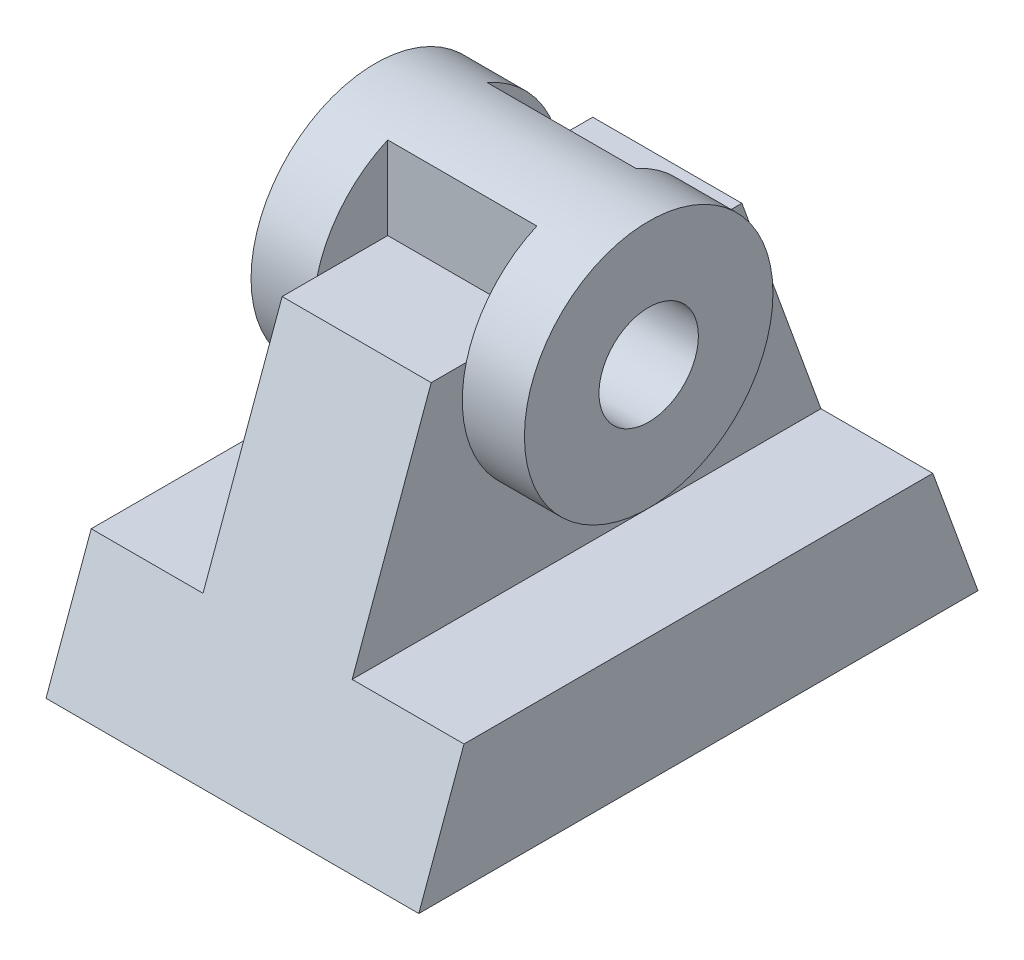
ISO-10303-21;
HEADER;
FILE_DESCRIPTION(('STEP AP214'),'2;1');
FILE_NAME('part.step','',(''),(''),'','','');
FILE_SCHEMA(('AUTOMOTIVE_DESIGN { 1 0 10303 214 1 1 1 1 }'));
ENDSEC;
DATA;
#1=APPLICATION_CONTEXT('core data for automotive mechanical design processes');
#2=APPLICATION_PROTOCOL_DEFINITION('international standard','automotive_design',2000,#1);
#3=PRODUCT_CONTEXT('',#1,'mechanical');
#4=PRODUCT('Part','Part','',(#3));
#5=PRODUCT_RELATED_PRODUCT_CATEGORY('part','',(#4));
#6=PRODUCT_DEFINITION_FORMATION('','',#4);
#7=PRODUCT_DEFINITION_CONTEXT('part definition',#1,'design');
#8=PRODUCT_DEFINITION('design','',#6,#7);
#9=PRODUCT_DEFINITION_SHAPE('','',#8);
#10=(LENGTH_UNIT() NAMED_UNIT(*) SI_UNIT(.MILLI.,.METRE.));
#11=(NAMED_UNIT(*) PLANE_ANGLE_UNIT() SI_UNIT($,.RADIAN.));
#12=(NAMED_UNIT(*) SI_UNIT($,.STERADIAN.) SOLID_ANGLE_UNIT());
#13=UNCERTAINTY_MEASURE_WITH_UNIT(LENGTH_MEASURE(1.E-05),#10,'distance_accuracy_value','');
#14=(GEOMETRIC_REPRESENTATION_CONTEXT(3) GLOBAL_UNCERTAINTY_ASSIGNED_CONTEXT((#13)) GLOBAL_UNIT_ASSIGNED_CONTEXT((#10,
#11,#12)) REPRESENTATION_CONTEXT('',''));
#15=CARTESIAN_POINT('',(0.,0.,0.));
#16=DIRECTION('',(0.,0.,1.));
#17=DIRECTION('',(1.,0.,0.));
#18=AXIS2_PLACEMENT_3D('',#15,#16,#17);
#19=CARTESIAN_POINT('',(22.,50.,0.));
#20=DIRECTION('',(-1.,0.,0.));
#21=DIRECTION('',(0.,0.,1.));
#22=AXIS2_PLACEMENT_3D('',#19,#20,#21);
#23=CYLINDRICAL_SURFACE('',#22,20.);
#24=CARTESIAN_POINT('',(-22.,50.,0.));
#25=DIRECTION('',(1.,0.,0.));
#26=DIRECTION('',(0.,0.,-1.));
#27=AXIS2_PLACEMENT_3D('',#24,#25,#26);
#28=CIRCLE('',#27,20.);
#29=CARTESIAN_POINT('',(-22.,50.,-20.));
#30=VERTEX_POINT('',#29);
#31=EDGE_CURVE('E184',#30,#30,#28,.T.);
#32=ORIENTED_EDGE('',*,*,#31,.T.);
#33=EDGE_LOOP('',(#32));
#34=FACE_BOUND('',#33,.T.);
#35=CARTESIAN_POINT('',(22.,50.,0.));
#36=DIRECTION('',(1.,0.,0.));
#37=DIRECTION('',(0.,0.,-1.));
#38=AXIS2_PLACEMENT_3D('',#35,#36,#37);
#39=CIRCLE('',#38,20.);
#40=CARTESIAN_POINT('',(22.,50.,-20.));
#41=VERTEX_POINT('',#40);
#42=EDGE_CURVE('E185',#41,#41,#39,.T.);
#43=ORIENTED_EDGE('',*,*,#42,.F.);
#44=EDGE_LOOP('',(#43));
#45=FACE_BOUND('',#44,.T.);
#46=CARTESIAN_POINT('',(-12.,50.,0.));
#47=DIRECTION('',(1.,0.,0.));
#48=DIRECTION('',(0.,1.,0.));
#49=AXIS2_PLACEMENT_3D('',#46,#47,#48);
#50=CIRCLE('',#49,20.);
#51=CARTESIAN_POINT('',(-12.,55.,-19.3649167310371));
#52=VERTEX_POINT('',#51);
#53=CARTESIAN_POINT('',(-12.,55.,19.3649167310371));
#54=VERTEX_POINT('',#53);
#55=EDGE_CURVE('E188',#52,#54,#50,.F.);
#56=ORIENTED_EDGE('',*,*,#55,.T.);
#57=CARTESIAN_POINT('',(-12.,50.,0.));
#58=DIRECTION('',(-1.,0.,0.));
#59=DIRECTION('',(0.,0.,1.));
#60=AXIS2_PLACEMENT_3D('',#57,#58,#59);
#61=CIRCLE('',#60,20.);
#62=CARTESIAN_POINT('',(-12.,68.3303027798234,7.99999999999997));
#63=VERTEX_POINT('',#62);
#64=EDGE_CURVE('E11',#54,#63,#61,.T.);
#65=ORIENTED_EDGE('',*,*,#64,.T.);
#66=DIRECTION('',(-1.,0.,0.));
#67=VECTOR('',#66,1.);
#68=CARTESIAN_POINT('',(22.,68.3303027798234,7.99999999999997));
#69=LINE('',#68,#67);
#70=CARTESIAN_POINT('',(12.,68.3303027798234,7.99999999999997));
#71=VERTEX_POINT('',#70);
#72=EDGE_CURVE('E273',#71,#63,#69,.T.);
#73=ORIENTED_EDGE('',*,*,#72,.F.);
#74=CARTESIAN_POINT('',(12.,50.,0.));
#75=DIRECTION('',(-1.,0.,0.));
#76=DIRECTION('',(0.,0.,1.));
#77=AXIS2_PLACEMENT_3D('',#74,#75,#76);
#78=CIRCLE('',#77,20.);
#79=CARTESIAN_POINT('',(12.,55.,19.3649167310371));
#80=VERTEX_POINT('',#79);
#81=EDGE_CURVE('E53',#80,#71,#78,.T.);
#82=ORIENTED_EDGE('',*,*,#81,.F.);
#83=CARTESIAN_POINT('',(12.,50.,0.));
#84=DIRECTION('',(-1.,0.,0.));
#85=DIRECTION('',(0.,0.,1.));
#86=AXIS2_PLACEMENT_3D('',#83,#84,#85);
#87=CIRCLE('',#86,20.);
#88=CARTESIAN_POINT('',(12.,55.,-19.3649167310371));
#89=VERTEX_POINT('',#88);
#90=EDGE_CURVE('E261',#80,#89,#87,.F.);
#91=ORIENTED_EDGE('',*,*,#90,.T.);
#92=CARTESIAN_POINT('',(12.,50.,0.));
#93=DIRECTION('',(-1.,0.,0.));
#94=DIRECTION('',(0.,0.,1.));
#95=AXIS2_PLACEMENT_3D('',#92,#93,#94);
#96=CIRCLE('',#95,20.);
#97=CARTESIAN_POINT('',(12.,68.3303027798234,-8.00000000000003));
#98=VERTEX_POINT('',#97);
#99=EDGE_CURVE('E271',#98,#89,#96,.T.);
#100=ORIENTED_EDGE('',*,*,#99,.F.);
#101=DIRECTION('',(-1.,0.,0.));
#102=VECTOR('',#101,1.);
#103=CARTESIAN_POINT('',(22.,68.3303027798234,-8.00000000000003));
#104=LINE('',#103,#102);
#105=CARTESIAN_POINT('',(-12.,68.3303027798234,-8.00000000000003));
#106=VERTEX_POINT('',#105);
#107=EDGE_CURVE('E268',#98,#106,#104,.T.);
#108=ORIENTED_EDGE('',*,*,#107,.T.);
#109=CARTESIAN_POINT('',(-12.,50.,0.));
#110=DIRECTION('',(-1.,0.,0.));
#111=DIRECTION('',(0.,0.,1.));
#112=AXIS2_PLACEMENT_3D('',#109,#110,#111);
#113=CIRCLE('',#112,20.);
#114=EDGE_CURVE('E264',#106,#52,#113,.T.);
#115=ORIENTED_EDGE('',*,*,#114,.T.);
#116=EDGE_LOOP('',(#56,#65,#73,#82,#91,#100,#108,#115));
#117=FACE_BOUND('',#116,.T.);
#118=ADVANCED_FACE('F45',(#34,#45,#117),#23,.T.);
#119=CARTESIAN_POINT('',(30.,55.,25.));
#120=DIRECTION('',(0.,-1.,0.));
#121=DIRECTION('',(0.,0.,-1.));
#122=AXIS2_PLACEMENT_3D('',#119,#120,#121);
#123=PLANE('',#122);
#124=DIRECTION('',(0.,0.,1.));
#125=VECTOR('',#124,1.);
#126=CARTESIAN_POINT('',(12.,55.,-45.));
#127=LINE('',#126,#125);
#128=CARTESIAN_POINT('',(12.,55.,25.));
#129=VERTEX_POINT('',#128);
#130=EDGE_CURVE('E164',#80,#129,#127,.T.);
#131=ORIENTED_EDGE('',*,*,#130,.F.);
#132=DIRECTION('',(0.,0.,1.));
#133=VECTOR('',#132,1.);
#134=CARTESIAN_POINT('',(12.,55.,0.));
#135=LINE('',#134,#133);
#136=CARTESIAN_POINT('',(12.,55.,7.99999999999997));
#137=VERTEX_POINT('',#136);
#138=EDGE_CURVE('E152',#137,#80,#135,.T.);
#139=ORIENTED_EDGE('',*,*,#138,.F.);
#140=DIRECTION('',(1.,0.,0.));
#141=VECTOR('',#140,1.);
#142=CARTESIAN_POINT('',(0.,55.,7.99999999999997));
#143=LINE('',#142,#141);
#144=CARTESIAN_POINT('',(-12.,55.,7.99999999999997));
#145=VERTEX_POINT('',#144);
#146=EDGE_CURVE('E145',#145,#137,#143,.T.);
#147=ORIENTED_EDGE('',*,*,#146,.F.);
#148=DIRECTION('',(0.,0.,1.));
#149=VECTOR('',#148,1.);
#150=CARTESIAN_POINT('',(-12.,55.,0.));
#151=LINE('',#150,#149);
#152=EDGE_CURVE('E159',#145,#54,#151,.T.);
#153=ORIENTED_EDGE('',*,*,#152,.T.);
#154=DIRECTION('',(0.,0.,1.));
#155=VECTOR('',#154,1.);
#156=CARTESIAN_POINT('',(-12.,55.,-45.));
#157=LINE('',#156,#155);
#158=CARTESIAN_POINT('',(-12.,55.,25.));
#159=VERTEX_POINT('',#158);
#160=EDGE_CURVE('E198',#54,#159,#157,.T.);
#161=ORIENTED_EDGE('',*,*,#160,.T.);
#162=DIRECTION('',(-1.,0.,0.));
#163=VECTOR('',#162,1.);
#164=CARTESIAN_POINT('',(30.,55.,25.));
#165=LINE('',#164,#163);
#166=EDGE_CURVE('E244',#129,#159,#165,.T.);
#167=ORIENTED_EDGE('',*,*,#166,.F.);
#168=EDGE_LOOP('',(#131,#139,#147,#153,#161,#167));
#169=FACE_BOUND('',#168,.T.);
#170=ADVANCED_FACE('F162',(#169),#123,.F.);
#171=CARTESIAN_POINT('',(-12.,55.,-25.));
#172=VERTEX_POINT('',#171);
#173=EDGE_CURVE('E194',#172,#52,#157,.T.);
#174=ORIENTED_EDGE('',*,*,#173,.T.);
#175=DIRECTION('',(0.,0.,1.));
#176=VECTOR('',#175,1.);
#177=CARTESIAN_POINT('',(-12.,55.,0.));
#178=LINE('',#177,#176);
#179=CARTESIAN_POINT('',(-12.,55.,-8.00000000000003));
#180=VERTEX_POINT('',#179);
#181=EDGE_CURVE('E68',#52,#180,#178,.T.);
#182=ORIENTED_EDGE('',*,*,#181,.T.);
#183=DIRECTION('',(1.,0.,0.));
#184=VECTOR('',#183,1.);
#185=CARTESIAN_POINT('',(0.,55.,-8.00000000000003));
#186=LINE('',#185,#184);
#187=CARTESIAN_POINT('',(12.,55.,-8.00000000000003));
#188=VERTEX_POINT('',#187);
#189=EDGE_CURVE('E170',#180,#188,#186,.T.);
#190=ORIENTED_EDGE('',*,*,#189,.T.);
#191=DIRECTION('',(0.,0.,1.));
#192=VECTOR('',#191,1.);
#193=CARTESIAN_POINT('',(12.,55.,0.));
#194=LINE('',#193,#192);
#195=EDGE_CURVE('E174',#89,#188,#194,.T.);
#196=ORIENTED_EDGE('',*,*,#195,.F.);
#197=CARTESIAN_POINT('',(12.,55.,-25.));
#198=VERTEX_POINT('',#197);
#199=EDGE_CURVE('E202',#198,#89,#127,.T.);
#200=ORIENTED_EDGE('',*,*,#199,.F.);
#201=DIRECTION('',(-1.,0.,0.));
#202=VECTOR('',#201,1.);
#203=CARTESIAN_POINT('',(30.,55.,-25.));
#204=LINE('',#203,#202);
#205=EDGE_CURVE('E247',#198,#172,#204,.T.);
#206=ORIENTED_EDGE('',*,*,#205,.T.);
#207=EDGE_LOOP('',(#174,#182,#190,#196,#200,#206));
#208=FACE_BOUND('',#207,.T.);
#209=ADVANCED_FACE('F283',(#208),#123,.F.);
#210=CARTESIAN_POINT('',(30.,0.,-45.));
#211=DIRECTION('',(0.,-0.341743063086704,0.939793423488437));
#212=DIRECTION('',(0.,-0.939793423488437,-0.341743063086704));
#213=AXIS2_PLACEMENT_3D('',#210,#211,#212);
#214=PLANE('',#213);
#215=DIRECTION('',(1.,0.,0.));
#216=VECTOR('',#215,1.);
#217=CARTESIAN_POINT('',(30.,20.,-37.7272727272727));
#218=LINE('',#217,#216);
#219=CARTESIAN_POINT('',(-30.,20.,-37.7272727272727));
#220=VERTEX_POINT('',#219);
#221=CARTESIAN_POINT('',(-12.,20.,-37.7272727272727));
#222=VERTEX_POINT('',#221);
#223=EDGE_CURVE('E209',#220,#222,#218,.T.);
#224=ORIENTED_EDGE('',*,*,#223,.T.);
#225=DIRECTION('',(0.,0.939793423488437,0.341743063086704));
#226=VECTOR('',#225,1.);
#227=CARTESIAN_POINT('',(-12.,0.,-45.));
#228=LINE('',#227,#226);
#229=EDGE_CURVE('E221',#222,#172,#228,.T.);
#230=ORIENTED_EDGE('',*,*,#229,.T.);
#231=ORIENTED_EDGE('',*,*,#205,.F.);
#232=DIRECTION('',(0.,-0.939793423488437,-0.341743063086704));
#233=VECTOR('',#232,1.);
#234=CARTESIAN_POINT('',(12.,0.,-45.));
#235=LINE('',#234,#233);
#236=CARTESIAN_POINT('',(12.,20.,-37.7272727272727));
#237=VERTEX_POINT('',#236);
#238=EDGE_CURVE('E218',#198,#237,#235,.T.);
#239=ORIENTED_EDGE('',*,*,#238,.T.);
#240=DIRECTION('',(1.,0.,0.));
#241=VECTOR('',#240,1.);
#242=CARTESIAN_POINT('',(30.,20.,-37.7272727272727));
#243=LINE('',#242,#241);
#244=CARTESIAN_POINT('',(30.,20.,-37.7272727272727));
#245=VERTEX_POINT('',#244);
#246=EDGE_CURVE('E215',#237,#245,#243,.T.);
#247=ORIENTED_EDGE('',*,*,#246,.T.);
#248=DIRECTION('',(0.,0.939793423488437,0.341743063086704));
#249=VECTOR('',#248,1.);
#250=CARTESIAN_POINT('',(30.,0.,-45.));
#251=LINE('',#250,#249);
#252=CARTESIAN_POINT('',(30.,0.,-45.));
#253=VERTEX_POINT('',#252);
#254=EDGE_CURVE('E225',#253,#245,#251,.T.);
#255=ORIENTED_EDGE('',*,*,#254,.F.);
#256=DIRECTION('',(-1.,0.,0.));
#257=VECTOR('',#256,1.);
#258=CARTESIAN_POINT('',(30.,0.,-45.));
#259=LINE('',#258,#257);
#260=CARTESIAN_POINT('',(-30.,0.,-45.));
#261=VERTEX_POINT('',#260);
#262=EDGE_CURVE('E233',#253,#261,#259,.T.);
#263=ORIENTED_EDGE('',*,*,#262,.T.);
#264=DIRECTION('',(0.,0.939793423488437,0.341743063086704));
#265=VECTOR('',#264,1.);
#266=CARTESIAN_POINT('',(-30.,0.,-45.));
#267=LINE('',#266,#265);
#268=EDGE_CURVE('E224',#261,#220,#267,.T.);
#269=ORIENTED_EDGE('',*,*,#268,.T.);
#270=EDGE_LOOP('',(#224,#230,#231,#239,#247,#255,#263,#269));
#271=FACE_BOUND('',#270,.T.);
#272=ADVANCED_FACE('F47',(#271),#214,.F.);
#273=CARTESIAN_POINT('',(30.,0.,45.));
#274=DIRECTION('',(0.,-0.341743063086704,-0.939793423488437));
#275=DIRECTION('',(0.,0.939793423488437,-0.341743063086704));
#276=AXIS2_PLACEMENT_3D('',#273,#274,#275);
#277=PLANE('',#276);
#278=ORIENTED_EDGE('',*,*,#166,.T.);
#279=DIRECTION('',(0.,-0.939793423488437,0.341743063086704));
#280=VECTOR('',#279,1.);
#281=CARTESIAN_POINT('',(-12.,0.,45.));
#282=LINE('',#281,#280);
#283=CARTESIAN_POINT('',(-12.,20.,37.7272727272727));
#284=VERTEX_POINT('',#283);
#285=EDGE_CURVE('E258',#159,#284,#282,.T.);
#286=ORIENTED_EDGE('',*,*,#285,.T.);
#287=DIRECTION('',(-1.,0.,0.));
#288=VECTOR('',#287,1.);
#289=CARTESIAN_POINT('',(30.,20.,37.7272727272727));
#290=LINE('',#289,#288);
#291=CARTESIAN_POINT('',(-30.,20.,37.7272727272727));
#292=VERTEX_POINT('',#291);
#293=EDGE_CURVE('E197',#284,#292,#290,.T.);
#294=ORIENTED_EDGE('',*,*,#293,.T.);
#295=DIRECTION('',(0.,-0.939793423488437,0.341743063086704));
#296=VECTOR('',#295,1.);
#297=CARTESIAN_POINT('',(-30.,0.,45.));
#298=LINE('',#297,#296);
#299=CARTESIAN_POINT('',(-30.,0.,45.));
#300=VERTEX_POINT('',#299);
#301=EDGE_CURVE('E236',#292,#300,#298,.T.);
#302=ORIENTED_EDGE('',*,*,#301,.T.);
#303=DIRECTION('',(-1.,0.,0.));
#304=VECTOR('',#303,1.);
#305=CARTESIAN_POINT('',(30.,0.,45.));
#306=LINE('',#305,#304);
#307=CARTESIAN_POINT('',(30.,0.,45.));
#308=VERTEX_POINT('',#307);
#309=EDGE_CURVE('E241',#308,#300,#306,.T.);
#310=ORIENTED_EDGE('',*,*,#309,.F.);
#311=DIRECTION('',(0.,-0.939793423488437,0.341743063086704));
#312=VECTOR('',#311,1.);
#313=CARTESIAN_POINT('',(30.,0.,45.));
#314=LINE('',#313,#312);
#315=CARTESIAN_POINT('',(30.,20.,37.7272727272727));
#316=VERTEX_POINT('',#315);
#317=EDGE_CURVE('E228',#316,#308,#314,.T.);
#318=ORIENTED_EDGE('',*,*,#317,.F.);
#319=DIRECTION('',(-1.,0.,0.));
#320=VECTOR('',#319,1.);
#321=CARTESIAN_POINT('',(30.,20.,37.7272727272727));
#322=LINE('',#321,#320);
#323=CARTESIAN_POINT('',(12.,20.,37.7272727272727));
#324=VERTEX_POINT('',#323);
#325=EDGE_CURVE('E212',#316,#324,#322,.T.);
#326=ORIENTED_EDGE('',*,*,#325,.T.);
#327=DIRECTION('',(0.,0.939793423488437,-0.341743063086704));
#328=VECTOR('',#327,1.);
#329=CARTESIAN_POINT('',(12.,0.,45.));
#330=LINE('',#329,#328);
#331=EDGE_CURVE('E255',#324,#129,#330,.T.);
#332=ORIENTED_EDGE('',*,*,#331,.T.);
#333=EDGE_LOOP('',(#278,#286,#294,#302,#310,#318,#326,#332));
#334=FACE_BOUND('',#333,.T.);
#335=ADVANCED_FACE('F295',(#334),#277,.F.);
#336=CARTESIAN_POINT('',(30.,0.,-45.));
#337=DIRECTION('',(0.,1.,0.));
#338=DIRECTION('',(0.,0.,1.));
#339=AXIS2_PLACEMENT_3D('',#336,#337,#338);
#340=PLANE('',#339);
#341=DIRECTION('',(0.,0.,-1.));
#342=VECTOR('',#341,1.);
#343=CARTESIAN_POINT('',(-30.,0.,-45.));
#344=LINE('',#343,#342);
#345=EDGE_CURVE('E229',#300,#261,#344,.T.);
#346=ORIENTED_EDGE('',*,*,#345,.T.);
#347=ORIENTED_EDGE('',*,*,#262,.F.);
#348=DIRECTION('',(0.,0.,-1.));
#349=VECTOR('',#348,1.);
#350=CARTESIAN_POINT('',(30.,0.,-45.));
#351=LINE('',#350,#349);
#352=EDGE_CURVE('E231',#308,#253,#351,.T.);
#353=ORIENTED_EDGE('',*,*,#352,.F.);
#354=ORIENTED_EDGE('',*,*,#309,.T.);
#355=EDGE_LOOP('',(#346,#347,#353,#354));
#356=FACE_BOUND('',#355,.T.);
#357=ADVANCED_FACE('F303',(#356),#340,.F.);
#358=CARTESIAN_POINT('',(30.,0.,0.));
#359=DIRECTION('',(-1.,0.,0.));
#360=DIRECTION('',(0.,0.,1.));
#361=AXIS2_PLACEMENT_3D('',#358,#359,#360);
#362=PLANE('',#361);
#363=ORIENTED_EDGE('',*,*,#254,.T.);
#364=DIRECTION('',(0.,0.,1.));
#365=VECTOR('',#364,1.);
#366=CARTESIAN_POINT('',(30.,20.,0.));
#367=LINE('',#366,#365);
#368=EDGE_CURVE('E252',#245,#316,#367,.T.);
#369=ORIENTED_EDGE('',*,*,#368,.T.);
#370=ORIENTED_EDGE('',*,*,#317,.T.);
#371=ORIENTED_EDGE('',*,*,#352,.T.);
#372=EDGE_LOOP('',(#363,#369,#370,#371));
#373=FACE_BOUND('',#372,.T.);
#374=ADVANCED_FACE('F307',(#373),#362,.F.);
#375=CARTESIAN_POINT('',(-30.,0.,0.));
#376=DIRECTION('',(-1.,0.,0.));
#377=DIRECTION('',(0.,0.,1.));
#378=AXIS2_PLACEMENT_3D('',#375,#376,#377);
#379=PLANE('',#378);
#380=DIRECTION('',(0.,0.,1.));
#381=VECTOR('',#380,1.);
#382=CARTESIAN_POINT('',(-30.,20.,0.));
#383=LINE('',#382,#381);
#384=EDGE_CURVE('E250',#220,#292,#383,.T.);
#385=ORIENTED_EDGE('',*,*,#384,.F.);
#386=ORIENTED_EDGE('',*,*,#268,.F.);
#387=ORIENTED_EDGE('',*,*,#345,.F.);
#388=ORIENTED_EDGE('',*,*,#301,.F.);
#389=EDGE_LOOP('',(#385,#386,#387,#388));
#390=FACE_BOUND('',#389,.T.);
#391=ADVANCED_FACE('F299',(#390),#379,.T.);
#392=CARTESIAN_POINT('',(-12.,55.,-45.));
#393=DIRECTION('',(1.,0.,0.));
#394=DIRECTION('',(0.,1.,0.));
#395=AXIS2_PLACEMENT_3D('',#392,#393,#394);
#396=PLANE('',#395);
#397=ORIENTED_EDGE('',*,*,#55,.F.);
#398=ORIENTED_EDGE('',*,*,#173,.F.);
#399=ORIENTED_EDGE('',*,*,#229,.F.);
#400=DIRECTION('',(0.,0.,1.));
#401=VECTOR('',#400,1.);
#402=CARTESIAN_POINT('',(-12.,20.,-45.));
#403=LINE('',#402,#401);
#404=EDGE_CURVE('E199',#222,#284,#403,.T.);
#405=ORIENTED_EDGE('',*,*,#404,.T.);
#406=ORIENTED_EDGE('',*,*,#285,.F.);
#407=ORIENTED_EDGE('',*,*,#160,.F.);
#408=EDGE_LOOP('',(#397,#398,#399,#405,#406,#407));
#409=FACE_BOUND('',#408,.T.);
#410=ADVANCED_FACE('F280',(#409),#396,.F.);
#411=CARTESIAN_POINT('',(-30.,20.,-45.));
#412=DIRECTION('',(0.,-1.,0.));
#413=DIRECTION('',(1.,0.,0.));
#414=AXIS2_PLACEMENT_3D('',#411,#412,#413);
#415=PLANE('',#414);
#416=ORIENTED_EDGE('',*,*,#384,.T.);
#417=ORIENTED_EDGE('',*,*,#293,.F.);
#418=ORIENTED_EDGE('',*,*,#404,.F.);
#419=ORIENTED_EDGE('',*,*,#223,.F.);
#420=EDGE_LOOP('',(#416,#417,#418,#419));
#421=FACE_BOUND('',#420,.T.);
#422=ADVANCED_FACE('F291',(#421),#415,.F.);
#423=CARTESIAN_POINT('',(12.,20.,-45.));
#424=DIRECTION('',(-1.,0.,0.));
#425=DIRECTION('',(0.,0.,1.));
#426=AXIS2_PLACEMENT_3D('',#423,#424,#425);
#427=PLANE('',#426);
#428=ORIENTED_EDGE('',*,*,#90,.F.);
#429=ORIENTED_EDGE('',*,*,#130,.T.);
#430=ORIENTED_EDGE('',*,*,#331,.F.);
#431=DIRECTION('',(0.,0.,1.));
#432=VECTOR('',#431,1.);
#433=CARTESIAN_POINT('',(12.,20.,-45.));
#434=LINE('',#433,#432);
#435=EDGE_CURVE('E193',#237,#324,#434,.T.);
#436=ORIENTED_EDGE('',*,*,#435,.F.);
#437=ORIENTED_EDGE('',*,*,#238,.F.);
#438=ORIENTED_EDGE('',*,*,#199,.T.);
#439=EDGE_LOOP('',(#428,#429,#430,#436,#437,#438));
#440=FACE_BOUND('',#439,.T.);
#441=ADVANCED_FACE('F314',(#440),#427,.F.);
#442=CARTESIAN_POINT('',(12.,20.,-45.));
#443=DIRECTION('',(0.,-1.,0.));
#444=DIRECTION('',(0.,0.,-1.));
#445=AXIS2_PLACEMENT_3D('',#442,#443,#444);
#446=PLANE('',#445);
#447=ORIENTED_EDGE('',*,*,#435,.T.);
#448=ORIENTED_EDGE('',*,*,#325,.F.);
#449=ORIENTED_EDGE('',*,*,#368,.F.);
#450=ORIENTED_EDGE('',*,*,#246,.F.);
#451=EDGE_LOOP('',(#447,#448,#449,#450));
#452=FACE_BOUND('',#451,.T.);
#453=ADVANCED_FACE('F310',(#452),#446,.F.);
#454=CARTESIAN_POINT('',(22.,50.,0.));
#455=DIRECTION('',(1.,0.,0.));
#456=DIRECTION('',(0.,0.,-1.));
#457=AXIS2_PLACEMENT_3D('',#454,#455,#456);
#458=PLANE('',#457);
#459=CARTESIAN_POINT('',(22.,50.,0.));
#460=DIRECTION('',(1.,0.,0.));
#461=DIRECTION('',(0.,0.,-1.));
#462=AXIS2_PLACEMENT_3D('',#459,#460,#461);
#463=CIRCLE('',#462,8.);
#464=CARTESIAN_POINT('',(22.,50.,-8.));
#465=VERTEX_POINT('',#464);
#466=EDGE_CURVE('E181',#465,#465,#463,.T.);
#467=ORIENTED_EDGE('',*,*,#466,.F.);
#468=EDGE_LOOP('',(#467));
#469=FACE_BOUND('',#468,.T.);
#470=ORIENTED_EDGE('',*,*,#42,.T.);
#471=EDGE_LOOP('',(#470));
#472=FACE_BOUND('',#471,.T.);
#473=ADVANCED_FACE('F348',(#469,#472),#458,.T.);
#474=CARTESIAN_POINT('',(-22.,50.,0.));
#475=DIRECTION('',(1.,0.,0.));
#476=DIRECTION('',(0.,0.,-1.));
#477=AXIS2_PLACEMENT_3D('',#474,#475,#476);
#478=PLANE('',#477);
#479=CARTESIAN_POINT('',(-22.,50.,0.));
#480=DIRECTION('',(1.,0.,0.));
#481=DIRECTION('',(0.,0.,-1.));
#482=AXIS2_PLACEMENT_3D('',#479,#480,#481);
#483=CIRCLE('',#482,8.);
#484=CARTESIAN_POINT('',(-22.,50.,-8.));
#485=VERTEX_POINT('',#484);
#486=EDGE_CURVE('E169',#485,#485,#483,.T.);
#487=ORIENTED_EDGE('',*,*,#486,.T.);
#488=EDGE_LOOP('',(#487));
#489=FACE_BOUND('',#488,.T.);
#490=ORIENTED_EDGE('',*,*,#31,.F.);
#491=EDGE_LOOP('',(#490));
#492=FACE_BOUND('',#491,.T.);
#493=ADVANCED_FACE('F340',(#489,#492),#478,.F.);
#494=CARTESIAN_POINT('',(-30.,50.,0.));
#495=DIRECTION('',(1.,0.,0.));
#496=DIRECTION('',(0.,0.,-1.));
#497=AXIS2_PLACEMENT_3D('',#494,#495,#496);
#498=CYLINDRICAL_SURFACE('',#497,8.);
#499=ORIENTED_EDGE('',*,*,#466,.T.);
#500=EDGE_LOOP('',(#499));
#501=FACE_BOUND('',#500,.T.);
#502=ORIENTED_EDGE('',*,*,#486,.F.);
#503=EDGE_LOOP('',(#502));
#504=FACE_BOUND('',#503,.T.);
#505=ADVANCED_FACE('F385',(#501,#504),#498,.F.);
#506=CARTESIAN_POINT('',(0.,25.5891176602945,-8.00000000000003));
#507=DIRECTION('',(0.,0.,1.));
#508=DIRECTION('',(1.,0.,0.));
#509=AXIS2_PLACEMENT_3D('',#506,#507,#508);
#510=PLANE('',#509);
#511=DIRECTION('',(0.,1.,0.));
#512=VECTOR('',#511,1.);
#513=CARTESIAN_POINT('',(12.,25.5891176602945,-8.00000000000003));
#514=LINE('',#513,#512);
#515=EDGE_CURVE('E173',#188,#98,#514,.T.);
#516=ORIENTED_EDGE('',*,*,#515,.F.);
#517=ORIENTED_EDGE('',*,*,#189,.F.);
#518=DIRECTION('',(0.,1.,0.));
#519=VECTOR('',#518,1.);
#520=CARTESIAN_POINT('',(-12.,25.5891176602945,-8.00000000000003));
#521=LINE('',#520,#519);
#522=EDGE_CURVE('E153',#180,#106,#521,.T.);
#523=ORIENTED_EDGE('',*,*,#522,.T.);
#524=ORIENTED_EDGE('',*,*,#107,.F.);
#525=EDGE_LOOP('',(#516,#517,#523,#524));
#526=FACE_BOUND('',#525,.T.);
#527=ADVANCED_FACE('F320',(#526),#510,.F.);
#528=CARTESIAN_POINT('',(12.,25.5891176602945,0.));
#529=DIRECTION('',(-1.,0.,0.));
#530=DIRECTION('',(0.,0.,1.));
#531=AXIS2_PLACEMENT_3D('',#528,#529,#530);
#532=PLANE('',#531);
#533=ORIENTED_EDGE('',*,*,#99,.T.);
#534=ORIENTED_EDGE('',*,*,#195,.T.);
#535=ORIENTED_EDGE('',*,*,#515,.T.);
#536=EDGE_LOOP('',(#533,#534,#535));
#537=FACE_BOUND('',#536,.T.);
#538=ADVANCED_FACE('F317',(#537),#532,.T.);
#539=CARTESIAN_POINT('',(-12.,25.5891176602945,0.));
#540=DIRECTION('',(-1.,0.,0.));
#541=DIRECTION('',(0.,0.,1.));
#542=AXIS2_PLACEMENT_3D('',#539,#540,#541);
#543=PLANE('',#542);
#544=ORIENTED_EDGE('',*,*,#522,.F.);
#545=ORIENTED_EDGE('',*,*,#181,.F.);
#546=ORIENTED_EDGE('',*,*,#114,.F.);
#547=EDGE_LOOP('',(#544,#545,#546));
#548=FACE_BOUND('',#547,.T.);
#549=ADVANCED_FACE('F321',(#548),#543,.F.);
#550=CARTESIAN_POINT('',(-12.,25.5891176602945,0.));
#551=DIRECTION('',(-1.,0.,0.));
#552=DIRECTION('',(0.,0.,1.));
#553=AXIS2_PLACEMENT_3D('',#550,#551,#552);
#554=PLANE('',#553);
#555=ORIENTED_EDGE('',*,*,#152,.F.);
#556=DIRECTION('',(0.,1.,0.));
#557=VECTOR('',#556,1.);
#558=CARTESIAN_POINT('',(-12.,25.5891176602945,7.99999999999997));
#559=LINE('',#558,#557);
#560=EDGE_CURVE('E148',#145,#63,#559,.T.);
#561=ORIENTED_EDGE('',*,*,#560,.T.);
#562=ORIENTED_EDGE('',*,*,#64,.F.);
#563=EDGE_LOOP('',(#555,#561,#562));
#564=FACE_BOUND('',#563,.T.);
#565=ADVANCED_FACE('F276',(#564),#554,.F.);
#566=CARTESIAN_POINT('',(12.,25.5891176602945,0.));
#567=DIRECTION('',(-1.,0.,0.));
#568=DIRECTION('',(0.,0.,1.));
#569=AXIS2_PLACEMENT_3D('',#566,#567,#568);
#570=PLANE('',#569);
#571=ORIENTED_EDGE('',*,*,#81,.T.);
#572=DIRECTION('',(0.,1.,0.));
#573=VECTOR('',#572,1.);
#574=CARTESIAN_POINT('',(12.,25.5891176602945,7.99999999999997));
#575=LINE('',#574,#573);
#576=EDGE_CURVE('E60',#137,#71,#575,.T.);
#577=ORIENTED_EDGE('',*,*,#576,.F.);
#578=ORIENTED_EDGE('',*,*,#138,.T.);
#579=EDGE_LOOP('',(#571,#577,#578));
#580=FACE_BOUND('',#579,.T.);
#581=ADVANCED_FACE('F156',(#580),#570,.T.);
#582=CARTESIAN_POINT('',(0.,25.5891176602945,7.99999999999997));
#583=DIRECTION('',(0.,0.,1.));
#584=DIRECTION('',(1.,0.,0.));
#585=AXIS2_PLACEMENT_3D('',#582,#583,#584);
#586=PLANE('',#585);
#587=ORIENTED_EDGE('',*,*,#72,.T.);
#588=ORIENTED_EDGE('',*,*,#560,.F.);
#589=ORIENTED_EDGE('',*,*,#146,.T.);
#590=ORIENTED_EDGE('',*,*,#576,.T.);
#591=EDGE_LOOP('',(#587,#588,#589,#590));
#592=FACE_BOUND('',#591,.T.);
#593=ADVANCED_FACE('F146',(#592),#586,.T.);
#594=CLOSED_SHELL('',(#118,#170,#209,#272,#335,#357,#374,#391,#410,#422,#441,#453,#473,#493,
#505,#527,#538,#549,#565,#581,#593));
#595=MANIFOLD_SOLID_BREP('B2',#594);
#596=ADVANCED_BREP_SHAPE_REPRESENTATION('',(#18,#595),#14);
#597=SHAPE_DEFINITION_REPRESENTATION(#9,#596);
ENDSEC;
END-ISO-10303-21;
